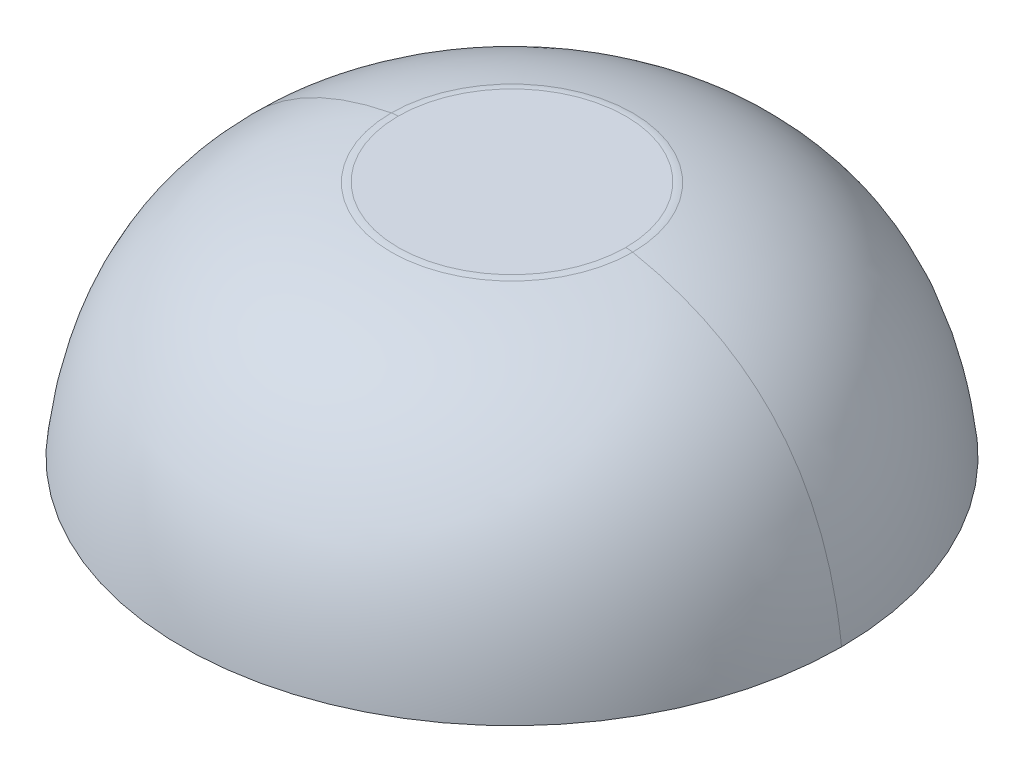
ISO-10303-21;
HEADER;
FILE_DESCRIPTION(('STEP AP214'),'2;1');
FILE_NAME('part.step','',(''),(''),'','','');
FILE_SCHEMA(('AUTOMOTIVE_DESIGN { 1 0 10303 214 1 1 1 1 }'));
ENDSEC;
DATA;
#1=APPLICATION_CONTEXT('core data for automotive mechanical design processes');
#2=APPLICATION_PROTOCOL_DEFINITION('international standard','automotive_design',2000,#1);
#3=PRODUCT_CONTEXT('',#1,'mechanical');
#4=PRODUCT('Part','Part','',(#3));
#5=PRODUCT_RELATED_PRODUCT_CATEGORY('part','',(#4));
#6=PRODUCT_DEFINITION_FORMATION('','',#4);
#7=PRODUCT_DEFINITION_CONTEXT('part definition',#1,'design');
#8=PRODUCT_DEFINITION('design','',#6,#7);
#9=PRODUCT_DEFINITION_SHAPE('','',#8);
#10=(LENGTH_UNIT() NAMED_UNIT(*) SI_UNIT(.MILLI.,.METRE.));
#11=(NAMED_UNIT(*) PLANE_ANGLE_UNIT() SI_UNIT($,.RADIAN.));
#12=(NAMED_UNIT(*) SI_UNIT($,.STERADIAN.) SOLID_ANGLE_UNIT());
#13=UNCERTAINTY_MEASURE_WITH_UNIT(LENGTH_MEASURE(1.E-05),#10,'distance_accuracy_value','');
#14=(GEOMETRIC_REPRESENTATION_CONTEXT(3) GLOBAL_UNCERTAINTY_ASSIGNED_CONTEXT((#13)) GLOBAL_UNIT_ASSIGNED_CONTEXT((#10,
#11,#12)) REPRESENTATION_CONTEXT('',''));
#15=CARTESIAN_POINT('',(0.,0.,0.));
#16=DIRECTION('',(0.,0.,1.));
#17=DIRECTION('',(1.,0.,0.));
#18=AXIS2_PLACEMENT_3D('',#15,#16,#17);
#19=CARTESIAN_POINT('',(-0.329598661351435,0.648202934982108,0.));
#20=CARTESIAN_POINT('',(-0.329598661351434,0.648202934982108,-0.659197322702869));
#21=CARTESIAN_POINT('',(0.329598661351434,0.648202934982108,-0.659197322702869));
#22=CARTESIAN_POINT('',(0.329598661351435,0.648202934982108,0.));
#23=CARTESIAN_POINT('',(-0.837881551850093,0.55052016665633,0.));
#24=CARTESIAN_POINT('',(-0.837881551850093,0.550520166656329,-1.67576310370019));
#25=CARTESIAN_POINT('',(0.837881551850092,0.550520166656329,-1.67576310370019));
#26=CARTESIAN_POINT('',(0.837881551850093,0.55052016665633,0.));
#27=CARTESIAN_POINT('',(-0.9,0.,0.));
#28=CARTESIAN_POINT('',(-0.899999999999999,0.,-1.8));
#29=CARTESIAN_POINT('',(0.899999999999999,0.,-1.8));
#30=CARTESIAN_POINT('',(0.9,0.,0.));
#31=(BOUNDED_SURFACE() B_SPLINE_SURFACE(2,3,((#19,#20,#21,#22),(#23,#24,#25,#26),(#27,#28,#29,
#30)),.UNSPECIFIED.,.F.,.F.,.F.) B_SPLINE_SURFACE_WITH_KNOTS((3,3),(4,4),(0.00931583339182367,
1.),(0.,1.),.UNSPECIFIED.) GEOMETRIC_REPRESENTATION_ITEM() RATIONAL_B_SPLINE_SURFACE(((1.,
0.333333333333334,0.333333333333334,1.),(1.,0.333333333333334,0.333333333333334,1.),(1.,
0.333333333333334,0.333333333333334,1.))) REPRESENTATION_ITEM('') SURFACE());
#32=CARTESIAN_POINT('',(0.,0.648202934982108,0.));
#33=DIRECTION('',(0.,-1.,0.));
#34=DIRECTION('',(1.,0.,0.));
#35=AXIS2_PLACEMENT_3D('',#32,#33,#34);
#36=CIRCLE('',#35,0.329598661351431);
#37=CARTESIAN_POINT('',(-0.329598661351435,0.648202934982108,0.));
#38=VERTEX_POINT('',#37);
#39=CARTESIAN_POINT('',(0.329598661351435,0.648202934982108,0.));
#40=VERTEX_POINT('',#39);
#41=EDGE_CURVE('E11',#38,#40,#36,.T.);
#42=CARTESIAN_POINT('',(0.329598661351435,0.648202934982108,0.));
#43=CARTESIAN_POINT('',(0.837881551850093,0.55052016665633,0.));
#44=CARTESIAN_POINT('',(0.9,0.,0.));
#45=(BOUNDED_CURVE() B_SPLINE_CURVE(2,(#42,#43,#44),.UNSPECIFIED.,.F.,
.F.) B_SPLINE_CURVE_WITH_KNOTS((3,3),(0.00931583339182367,1.),
.UNSPECIFIED.) CURVE() GEOMETRIC_REPRESENTATION_ITEM() RATIONAL_B_SPLINE_CURVE((1.,1.,1.)) REPRESENTATION_ITEM(''));
#46=CARTESIAN_POINT('',(0.9,0.,0.));
#47=VERTEX_POINT('',#46);
#48=EDGE_CURVE('E28',#40,#47,#45,.T.);
#49=CARTESIAN_POINT('',(0.,0.,0.));
#50=DIRECTION('',(0.,-1.,0.));
#51=DIRECTION('',(1.,0.,0.));
#52=AXIS2_PLACEMENT_3D('',#49,#50,#51);
#53=CIRCLE('',#52,0.9);
#54=CARTESIAN_POINT('',(-0.9,0.,0.));
#55=VERTEX_POINT('',#54);
#56=EDGE_CURVE('E83',#55,#47,#53,.T.);
#57=CARTESIAN_POINT('',(-0.329598661351435,0.648202934982108,0.));
#58=CARTESIAN_POINT('',(-0.837881551850093,0.55052016665633,0.));
#59=CARTESIAN_POINT('',(-0.9,0.,0.));
#60=(BOUNDED_CURVE() B_SPLINE_CURVE(2,(#57,#58,#59),.UNSPECIFIED.,.F.,
.F.) B_SPLINE_CURVE_WITH_KNOTS((3,3),(0.00931583339182367,1.),
.UNSPECIFIED.) CURVE() GEOMETRIC_REPRESENTATION_ITEM() RATIONAL_B_SPLINE_CURVE((1.,1.,1.)) REPRESENTATION_ITEM(''));
#61=EDGE_CURVE('E69',#38,#55,#60,.T.);
#62=ORIENTED_EDGE('',*,*,#41,.T.);
#63=ORIENTED_EDGE('',*,*,#48,.T.);
#64=ORIENTED_EDGE('',*,*,#56,.F.);
#65=ORIENTED_EDGE('',*,*,#61,.F.);
#66=EDGE_LOOP('',(#62,#63,#64,#65));
#67=FACE_BOUND('',#66,.T.);
#68=ADVANCED_FACE('F17',(#67),#31,.F.);
#69=CARTESIAN_POINT('',(0.,0.55,0.));
#70=DIRECTION('',(0.,-1.,0.));
#71=DIRECTION('',(1.,0.,0.));
#72=AXIS2_PLACEMENT_3D('',#69,#70,#71);
#73=TOROIDAL_SURFACE('',#72,0.310725835360085,0.1);
#74=CARTESIAN_POINT('',(0.,0.65,0.));
#75=DIRECTION('',(0.,1.,0.));
#76=DIRECTION('',(1.,0.,0.));
#77=AXIS2_PLACEMENT_3D('',#74,#75,#76);
#78=CIRCLE('',#77,0.310725835360085);
#79=CARTESIAN_POINT('',(-0.310725835360085,0.65,0.));
#80=VERTEX_POINT('',#79);
#81=CARTESIAN_POINT('',(0.310725835360085,0.65,0.));
#82=VERTEX_POINT('',#81);
#83=EDGE_CURVE('E21',#80,#82,#78,.T.);
#84=ORIENTED_EDGE('',*,*,#83,.F.);
#85=CARTESIAN_POINT('',(-0.310725835360085,0.55,0.));
#86=DIRECTION('',(0.,0.,1.));
#87=DIRECTION('',(1.,0.,0.));
#88=AXIS2_PLACEMENT_3D('',#85,#86,#87);
#89=CIRCLE('',#88,0.1);
#90=EDGE_CURVE('E86',#80,#38,#89,.T.);
#91=ORIENTED_EDGE('',*,*,#90,.T.);
#92=CARTESIAN_POINT('',(0.,0.648202934982108,0.));
#93=DIRECTION('',(0.,-1.,0.));
#94=DIRECTION('',(1.,0.,0.));
#95=AXIS2_PLACEMENT_3D('',#92,#93,#94);
#96=CIRCLE('',#95,0.329598661351431);
#97=EDGE_CURVE('E42',#40,#38,#96,.T.);
#98=ORIENTED_EDGE('',*,*,#97,.F.);
#99=CARTESIAN_POINT('',(0.310725835360085,0.55,0.));
#100=DIRECTION('',(0.,0.,-1.));
#101=DIRECTION('',(-1.,0.,0.));
#102=AXIS2_PLACEMENT_3D('',#99,#100,#101);
#103=CIRCLE('',#102,0.1);
#104=EDGE_CURVE('E55',#82,#40,#103,.T.);
#105=ORIENTED_EDGE('',*,*,#104,.F.);
#106=EDGE_LOOP('',(#84,#91,#98,#105));
#107=FACE_BOUND('',#106,.T.);
#108=ADVANCED_FACE('F117',(#107),#73,.T.);
#109=CARTESIAN_POINT('',(-0.9,0.,0.));
#110=DIRECTION('',(0.,1.,0.));
#111=DIRECTION('',(1.,0.,0.));
#112=AXIS2_PLACEMENT_3D('',#109,#110,#111);
#113=PLANE('',#112);
#114=ORIENTED_EDGE('',*,*,#56,.T.);
#115=CARTESIAN_POINT('',(0.,0.,0.));
#116=DIRECTION('',(0.,-1.,0.));
#117=DIRECTION('',(1.,0.,0.));
#118=AXIS2_PLACEMENT_3D('',#115,#116,#117);
#119=CIRCLE('',#118,0.9);
#120=EDGE_CURVE('E78',#47,#55,#119,.T.);
#121=ORIENTED_EDGE('',*,*,#120,.T.);
#122=EDGE_LOOP('',(#114,#121));
#123=FACE_BOUND('',#122,.T.);
#124=ADVANCED_FACE('F19',(#123),#113,.F.);
#125=CARTESIAN_POINT('',(0.329598661351435,0.648202934982108,0.));
#126=CARTESIAN_POINT('',(0.329598661351434,0.648202934982108,0.659197322702869));
#127=CARTESIAN_POINT('',(-0.329598661351434,0.648202934982108,0.659197322702869));
#128=CARTESIAN_POINT('',(-0.329598661351435,0.648202934982108,0.));
#129=CARTESIAN_POINT('',(0.837881551850093,0.55052016665633,0.));
#130=CARTESIAN_POINT('',(0.837881551850093,0.550520166656329,1.67576310370019));
#131=CARTESIAN_POINT('',(-0.837881551850092,0.550520166656329,1.67576310370019));
#132=CARTESIAN_POINT('',(-0.837881551850093,0.55052016665633,0.));
#133=CARTESIAN_POINT('',(0.9,0.,0.));
#134=CARTESIAN_POINT('',(0.899999999999999,0.,1.8));
#135=CARTESIAN_POINT('',(-0.899999999999999,0.,1.8));
#136=CARTESIAN_POINT('',(-0.9,0.,0.));
#137=(BOUNDED_SURFACE() B_SPLINE_SURFACE(2,3,((#125,#126,#127,#128),(#129,#130,#131,#132),(#133,
#134,#135,#136)),.UNSPECIFIED.,.F.,.F.,.F.) B_SPLINE_SURFACE_WITH_KNOTS((3,3),(4,4),
(0.00931583339182367,1.),(0.,1.),
.UNSPECIFIED.) GEOMETRIC_REPRESENTATION_ITEM() RATIONAL_B_SPLINE_SURFACE(((1.,0.333333333333334,
0.333333333333334,1.),(1.,0.333333333333334,0.333333333333334,1.),(1.,0.333333333333334,
0.333333333333334,1.))) REPRESENTATION_ITEM('') SURFACE());
#138=ORIENTED_EDGE('',*,*,#48,.F.);
#139=ORIENTED_EDGE('',*,*,#97,.T.);
#140=ORIENTED_EDGE('',*,*,#61,.T.);
#141=ORIENTED_EDGE('',*,*,#120,.F.);
#142=EDGE_LOOP('',(#138,#139,#140,#141));
#143=FACE_BOUND('',#142,.T.);
#144=ADVANCED_FACE('F76',(#143),#137,.F.);
#145=CARTESIAN_POINT('',(0.,0.65,0.));
#146=DIRECTION('',(0.,-1.,0.));
#147=DIRECTION('',(0.,0.,-1.));
#148=AXIS2_PLACEMENT_3D('',#145,#146,#147);
#149=PLANE('',#148);
#150=CARTESIAN_POINT('',(0.,0.65,0.));
#151=DIRECTION('',(0.,1.,0.));
#152=DIRECTION('',(1.,0.,0.));
#153=AXIS2_PLACEMENT_3D('',#150,#151,#152);
#154=CIRCLE('',#153,0.310725835360085);
#155=EDGE_CURVE('E80',#82,#80,#154,.T.);
#156=ORIENTED_EDGE('',*,*,#155,.T.);
#157=ORIENTED_EDGE('',*,*,#83,.T.);
#158=EDGE_LOOP('',(#156,#157));
#159=FACE_BOUND('',#158,.T.);
#160=ADVANCED_FACE('F128',(#159),#149,.F.);
#161=CARTESIAN_POINT('',(0.,0.55,0.));
#162=DIRECTION('',(0.,-1.,0.));
#163=DIRECTION('',(1.,0.,0.));
#164=AXIS2_PLACEMENT_3D('',#161,#162,#163);
#165=TOROIDAL_SURFACE('',#164,0.310725835360085,0.1);
#166=ORIENTED_EDGE('',*,*,#90,.F.);
#167=ORIENTED_EDGE('',*,*,#155,.F.);
#168=ORIENTED_EDGE('',*,*,#104,.T.);
#169=ORIENTED_EDGE('',*,*,#41,.F.);
#170=EDGE_LOOP('',(#166,#167,#168,#169));
#171=FACE_BOUND('',#170,.T.);
#172=ADVANCED_FACE('F120',(#171),#165,.T.);
#173=CLOSED_SHELL('',(#68,#108,#124,#144,#160,#172));
#174=MANIFOLD_SOLID_BREP('B1',#173);
#175=ADVANCED_BREP_SHAPE_REPRESENTATION('',(#18,#174),#14);
#176=SHAPE_DEFINITION_REPRESENTATION(#9,#175);
ENDSEC;
END-ISO-10303-21;
